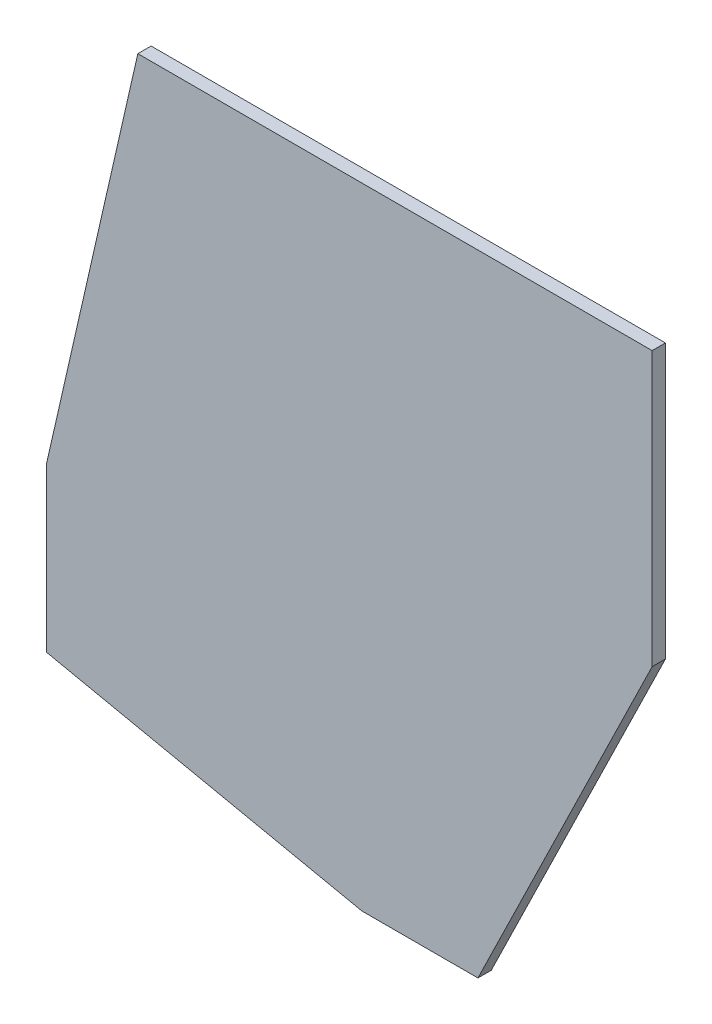
ISO-10303-21;
HEADER;
FILE_DESCRIPTION(('STEP AP214'),'2;1');
FILE_NAME('part.step','',(''),(''),'','','');
FILE_SCHEMA(('AUTOMOTIVE_DESIGN { 1 0 10303 214 1 1 1 1 }'));
ENDSEC;
DATA;
#1=APPLICATION_CONTEXT('core data for automotive mechanical design processes');
#2=APPLICATION_PROTOCOL_DEFINITION('international standard','automotive_design',2000,#1);
#3=PRODUCT_CONTEXT('',#1,'mechanical');
#4=PRODUCT('Part','Part','',(#3));
#5=PRODUCT_RELATED_PRODUCT_CATEGORY('part','',(#4));
#6=PRODUCT_DEFINITION_FORMATION('','',#4);
#7=PRODUCT_DEFINITION_CONTEXT('part definition',#1,'design');
#8=PRODUCT_DEFINITION('design','',#6,#7);
#9=PRODUCT_DEFINITION_SHAPE('','',#8);
#10=(LENGTH_UNIT() NAMED_UNIT(*) SI_UNIT(.MILLI.,.METRE.));
#11=(NAMED_UNIT(*) PLANE_ANGLE_UNIT() SI_UNIT($,.RADIAN.));
#12=(NAMED_UNIT(*) SI_UNIT($,.STERADIAN.) SOLID_ANGLE_UNIT());
#13=UNCERTAINTY_MEASURE_WITH_UNIT(LENGTH_MEASURE(1.E-05),#10,'distance_accuracy_value','');
#14=(GEOMETRIC_REPRESENTATION_CONTEXT(3) GLOBAL_UNCERTAINTY_ASSIGNED_CONTEXT((#13)) GLOBAL_UNIT_ASSIGNED_CONTEXT((#10,
#11,#12)) REPRESENTATION_CONTEXT('',''));
#15=CARTESIAN_POINT('',(0.,0.,0.));
#16=DIRECTION('',(0.,0.,1.));
#17=DIRECTION('',(1.,0.,0.));
#18=AXIS2_PLACEMENT_3D('',#15,#16,#17);
#19=CARTESIAN_POINT('',(730.,-760.,16.));
#20=DIRECTION('',(0.,0.,1.));
#21=DIRECTION('',(1.,0.,0.));
#22=AXIS2_PLACEMENT_3D('',#19,#20,#21);
#23=PLANE('',#22);
#24=DIRECTION('',(0.,1.,0.));
#25=VECTOR('',#24,1.);
#26=CARTESIAN_POINT('',(730.,0.,16.));
#27=LINE('',#26,#25);
#28=CARTESIAN_POINT('',(730.,-330.,16.));
#29=VERTEX_POINT('',#28);
#30=CARTESIAN_POINT('',(730.,0.,16.));
#31=VERTEX_POINT('',#30);
#32=EDGE_CURVE('E134',#29,#31,#27,.T.);
#33=ORIENTED_EDGE('',*,*,#32,.T.);
#34=DIRECTION('',(-1.,0.,0.));
#35=VECTOR('',#34,1.);
#36=CARTESIAN_POINT('',(110.,0.,16.));
#37=LINE('',#36,#35);
#38=CARTESIAN_POINT('',(110.,0.,16.));
#39=VERTEX_POINT('',#38);
#40=EDGE_CURVE('E89',#31,#39,#37,.T.);
#41=ORIENTED_EDGE('',*,*,#40,.T.);
#42=DIRECTION('',(-0.222150635205034,-0.975012356474522,0.));
#43=VECTOR('',#42,1.);
#44=CARTESIAN_POINT('',(0.,-482.786642105298,16.));
#45=LINE('',#44,#43);
#46=CARTESIAN_POINT('',(0.,-482.786642105298,16.));
#47=VERTEX_POINT('',#46);
#48=EDGE_CURVE('E146',#39,#47,#45,.T.);
#49=ORIENTED_EDGE('',*,*,#48,.T.);
#50=DIRECTION('',(0.,-1.,0.));
#51=VECTOR('',#50,1.);
#52=CARTESIAN_POINT('',(0.,-482.786642105298,16.));
#53=LINE('',#52,#51);
#54=CARTESIAN_POINT('',(1.20869745078236E-13,-680.,16.));
#55=VERTEX_POINT('',#54);
#56=EDGE_CURVE('E104',#47,#55,#53,.T.);
#57=ORIENTED_EDGE('',*,*,#56,.T.);
#58=DIRECTION('',(0.978549784986749,-0.206010481049842,0.));
#59=VECTOR('',#58,1.);
#60=CARTESIAN_POINT('',(1.20869745078236E-13,-680.,16.));
#61=LINE('',#60,#59);
#62=CARTESIAN_POINT('',(380.,-760.,16.));
#63=VERTEX_POINT('',#62);
#64=EDGE_CURVE('E99',#55,#63,#61,.T.);
#65=ORIENTED_EDGE('',*,*,#64,.T.);
#66=DIRECTION('',(1.,0.,0.));
#67=VECTOR('',#66,1.);
#68=CARTESIAN_POINT('',(380.,-760.,16.));
#69=LINE('',#68,#67);
#70=CARTESIAN_POINT('',(520.,-760.,16.));
#71=VERTEX_POINT('',#70);
#72=EDGE_CURVE('E102',#63,#71,#69,.T.);
#73=ORIENTED_EDGE('',*,*,#72,.T.);
#74=DIRECTION('',(0.438835298505001,0.898567515986432,0.));
#75=VECTOR('',#74,1.);
#76=CARTESIAN_POINT('',(730.,-330.,16.));
#77=LINE('',#76,#75);
#78=EDGE_CURVE('E49',#71,#29,#77,.T.);
#79=ORIENTED_EDGE('',*,*,#78,.T.);
#80=EDGE_LOOP('',(#33,#41,#49,#57,#65,#73,#79));
#81=FACE_BOUND('',#80,.T.);
#82=ADVANCED_FACE('F32',(#81),#23,.T.);
#83=CARTESIAN_POINT('',(730.,-760.,0.));
#84=DIRECTION('',(0.,0.,1.));
#85=DIRECTION('',(1.,0.,0.));
#86=AXIS2_PLACEMENT_3D('',#83,#84,#85);
#87=PLANE('',#86);
#88=DIRECTION('',(0.,1.,0.));
#89=VECTOR('',#88,1.);
#90=CARTESIAN_POINT('',(730.,0.,0.));
#91=LINE('',#90,#89);
#92=CARTESIAN_POINT('',(730.,-330.,0.));
#93=VERTEX_POINT('',#92);
#94=CARTESIAN_POINT('',(730.,0.,0.));
#95=VERTEX_POINT('',#94);
#96=EDGE_CURVE('E122',#93,#95,#91,.T.);
#97=ORIENTED_EDGE('',*,*,#96,.F.);
#98=DIRECTION('',(0.438835298505001,0.898567515986432,0.));
#99=VECTOR('',#98,1.);
#100=CARTESIAN_POINT('',(730.,-330.,0.));
#101=LINE('',#100,#99);
#102=CARTESIAN_POINT('',(520.,-760.,0.));
#103=VERTEX_POINT('',#102);
#104=EDGE_CURVE('E81',#103,#93,#101,.T.);
#105=ORIENTED_EDGE('',*,*,#104,.F.);
#106=DIRECTION('',(1.,0.,0.));
#107=VECTOR('',#106,1.);
#108=CARTESIAN_POINT('',(380.,-760.,0.));
#109=LINE('',#108,#107);
#110=CARTESIAN_POINT('',(380.,-760.,0.));
#111=VERTEX_POINT('',#110);
#112=EDGE_CURVE('E75',#111,#103,#109,.T.);
#113=ORIENTED_EDGE('',*,*,#112,.F.);
#114=DIRECTION('',(0.978549784986749,-0.206010481049842,0.));
#115=VECTOR('',#114,1.);
#116=CARTESIAN_POINT('',(1.20869745078236E-13,-680.,0.));
#117=LINE('',#116,#115);
#118=CARTESIAN_POINT('',(1.20869745078236E-13,-680.,0.));
#119=VERTEX_POINT('',#118);
#120=EDGE_CURVE('E112',#119,#111,#117,.T.);
#121=ORIENTED_EDGE('',*,*,#120,.F.);
#122=DIRECTION('',(0.,-1.,0.));
#123=VECTOR('',#122,1.);
#124=CARTESIAN_POINT('',(0.,-482.786642105298,0.));
#125=LINE('',#124,#123);
#126=CARTESIAN_POINT('',(0.,-482.786642105298,0.));
#127=VERTEX_POINT('',#126);
#128=EDGE_CURVE('E129',#127,#119,#125,.T.);
#129=ORIENTED_EDGE('',*,*,#128,.F.);
#130=DIRECTION('',(-0.222150635205034,-0.975012356474522,0.));
#131=VECTOR('',#130,1.);
#132=CARTESIAN_POINT('',(0.,-482.786642105298,0.));
#133=LINE('',#132,#131);
#134=CARTESIAN_POINT('',(110.,0.,0.));
#135=VERTEX_POINT('',#134);
#136=EDGE_CURVE('E127',#135,#127,#133,.T.);
#137=ORIENTED_EDGE('',*,*,#136,.F.);
#138=DIRECTION('',(-1.,0.,0.));
#139=VECTOR('',#138,1.);
#140=CARTESIAN_POINT('',(110.,0.,0.));
#141=LINE('',#140,#139);
#142=EDGE_CURVE('E125',#95,#135,#141,.T.);
#143=ORIENTED_EDGE('',*,*,#142,.F.);
#144=EDGE_LOOP('',(#97,#105,#113,#121,#129,#137,#143));
#145=FACE_BOUND('',#144,.T.);
#146=ADVANCED_FACE('F150',(#145),#87,.F.);
#147=CARTESIAN_POINT('',(730.,0.,16.));
#148=DIRECTION('',(-1.,0.,0.));
#149=DIRECTION('',(0.,0.,1.));
#150=AXIS2_PLACEMENT_3D('',#147,#148,#149);
#151=PLANE('',#150);
#152=ORIENTED_EDGE('',*,*,#96,.T.);
#153=DIRECTION('',(0.,0.,-1.));
#154=VECTOR('',#153,1.);
#155=CARTESIAN_POINT('',(730.,0.,16.));
#156=LINE('',#155,#154);
#157=EDGE_CURVE('E11',#31,#95,#156,.T.);
#158=ORIENTED_EDGE('',*,*,#157,.F.);
#159=ORIENTED_EDGE('',*,*,#32,.F.);
#160=DIRECTION('',(0.,0.,-1.));
#161=VECTOR('',#160,1.);
#162=CARTESIAN_POINT('',(730.,-330.,16.));
#163=LINE('',#162,#161);
#164=EDGE_CURVE('E118',#29,#93,#163,.T.);
#165=ORIENTED_EDGE('',*,*,#164,.T.);
#166=EDGE_LOOP('',(#152,#158,#159,#165));
#167=FACE_BOUND('',#166,.T.);
#168=ADVANCED_FACE('F34',(#167),#151,.F.);
#169=CARTESIAN_POINT('',(110.,0.,16.));
#170=DIRECTION('',(0.,-1.,0.));
#171=DIRECTION('',(0.,0.,-1.));
#172=AXIS2_PLACEMENT_3D('',#169,#170,#171);
#173=PLANE('',#172);
#174=ORIENTED_EDGE('',*,*,#142,.T.);
#175=DIRECTION('',(0.,0.,-1.));
#176=VECTOR('',#175,1.);
#177=CARTESIAN_POINT('',(110.,0.,16.));
#178=LINE('',#177,#176);
#179=EDGE_CURVE('E41',#39,#135,#178,.T.);
#180=ORIENTED_EDGE('',*,*,#179,.F.);
#181=ORIENTED_EDGE('',*,*,#40,.F.);
#182=ORIENTED_EDGE('',*,*,#157,.T.);
#183=EDGE_LOOP('',(#174,#180,#181,#182));
#184=FACE_BOUND('',#183,.T.);
#185=ADVANCED_FACE('F159',(#184),#173,.F.);
#186=CARTESIAN_POINT('',(0.,-482.786642105298,16.));
#187=DIRECTION('',(0.975012356474522,-0.222150635205034,0.));
#188=DIRECTION('',(0.222150635205034,0.975012356474522,0.));
#189=AXIS2_PLACEMENT_3D('',#186,#187,#188);
#190=PLANE('',#189);
#191=ORIENTED_EDGE('',*,*,#136,.T.);
#192=DIRECTION('',(0.,0.,-1.));
#193=VECTOR('',#192,1.);
#194=CARTESIAN_POINT('',(0.,-482.786642105298,16.));
#195=LINE('',#194,#193);
#196=EDGE_CURVE('E138',#47,#127,#195,.T.);
#197=ORIENTED_EDGE('',*,*,#196,.F.);
#198=ORIENTED_EDGE('',*,*,#48,.F.);
#199=ORIENTED_EDGE('',*,*,#179,.T.);
#200=EDGE_LOOP('',(#191,#197,#198,#199));
#201=FACE_BOUND('',#200,.T.);
#202=ADVANCED_FACE('F144',(#201),#190,.F.);
#203=CARTESIAN_POINT('',(0.,-482.786642105298,16.));
#204=DIRECTION('',(1.,0.,0.));
#205=DIRECTION('',(0.,1.,0.));
#206=AXIS2_PLACEMENT_3D('',#203,#204,#205);
#207=PLANE('',#206);
#208=ORIENTED_EDGE('',*,*,#128,.T.);
#209=DIRECTION('',(0.,0.,-1.));
#210=VECTOR('',#209,1.);
#211=CARTESIAN_POINT('',(1.20869745078236E-13,-680.,16.));
#212=LINE('',#211,#210);
#213=EDGE_CURVE('E113',#55,#119,#212,.T.);
#214=ORIENTED_EDGE('',*,*,#213,.F.);
#215=ORIENTED_EDGE('',*,*,#56,.F.);
#216=ORIENTED_EDGE('',*,*,#196,.T.);
#217=EDGE_LOOP('',(#208,#214,#215,#216));
#218=FACE_BOUND('',#217,.T.);
#219=ADVANCED_FACE('F152',(#218),#207,.F.);
#220=CARTESIAN_POINT('',(1.20869745078236E-13,-680.,16.));
#221=DIRECTION('',(0.206010481049842,0.978549784986749,0.));
#222=DIRECTION('',(-0.978549784986749,0.206010481049842,0.));
#223=AXIS2_PLACEMENT_3D('',#220,#221,#222);
#224=PLANE('',#223);
#225=ORIENTED_EDGE('',*,*,#120,.T.);
#226=DIRECTION('',(0.,0.,-1.));
#227=VECTOR('',#226,1.);
#228=CARTESIAN_POINT('',(380.,-760.,16.));
#229=LINE('',#228,#227);
#230=EDGE_CURVE('E109',#63,#111,#229,.T.);
#231=ORIENTED_EDGE('',*,*,#230,.F.);
#232=ORIENTED_EDGE('',*,*,#64,.F.);
#233=ORIENTED_EDGE('',*,*,#213,.T.);
#234=EDGE_LOOP('',(#225,#231,#232,#233));
#235=FACE_BOUND('',#234,.T.);
#236=ADVANCED_FACE('F110',(#235),#224,.F.);
#237=CARTESIAN_POINT('',(380.,-760.,16.));
#238=DIRECTION('',(0.,1.,0.));
#239=DIRECTION('',(0.,0.,1.));
#240=AXIS2_PLACEMENT_3D('',#237,#238,#239);
#241=PLANE('',#240);
#242=ORIENTED_EDGE('',*,*,#112,.T.);
#243=DIRECTION('',(0.,0.,-1.));
#244=VECTOR('',#243,1.);
#245=CARTESIAN_POINT('',(520.,-760.,16.));
#246=LINE('',#245,#244);
#247=EDGE_CURVE('E114',#71,#103,#246,.T.);
#248=ORIENTED_EDGE('',*,*,#247,.F.);
#249=ORIENTED_EDGE('',*,*,#72,.F.);
#250=ORIENTED_EDGE('',*,*,#230,.T.);
#251=EDGE_LOOP('',(#242,#248,#249,#250));
#252=FACE_BOUND('',#251,.T.);
#253=ADVANCED_FACE('F116',(#252),#241,.F.);
#254=CARTESIAN_POINT('',(730.,-330.,16.));
#255=DIRECTION('',(-0.898567515986432,0.438835298505001,0.));
#256=DIRECTION('',(-0.438835298505001,-0.898567515986432,0.));
#257=AXIS2_PLACEMENT_3D('',#254,#255,#256);
#258=PLANE('',#257);
#259=ORIENTED_EDGE('',*,*,#104,.T.);
#260=ORIENTED_EDGE('',*,*,#164,.F.);
#261=ORIENTED_EDGE('',*,*,#78,.F.);
#262=ORIENTED_EDGE('',*,*,#247,.T.);
#263=EDGE_LOOP('',(#259,#260,#261,#262));
#264=FACE_BOUND('',#263,.T.);
#265=ADVANCED_FACE('F173',(#264),#258,.F.);
#266=CLOSED_SHELL('',(#82,#146,#168,#185,#202,#219,#236,#253,#265));
#267=MANIFOLD_SOLID_BREP('B2',#266);
#268=ADVANCED_BREP_SHAPE_REPRESENTATION('',(#18,#267),#14);
#269=SHAPE_DEFINITION_REPRESENTATION(#9,#268);
ENDSEC;
END-ISO-10303-21;
